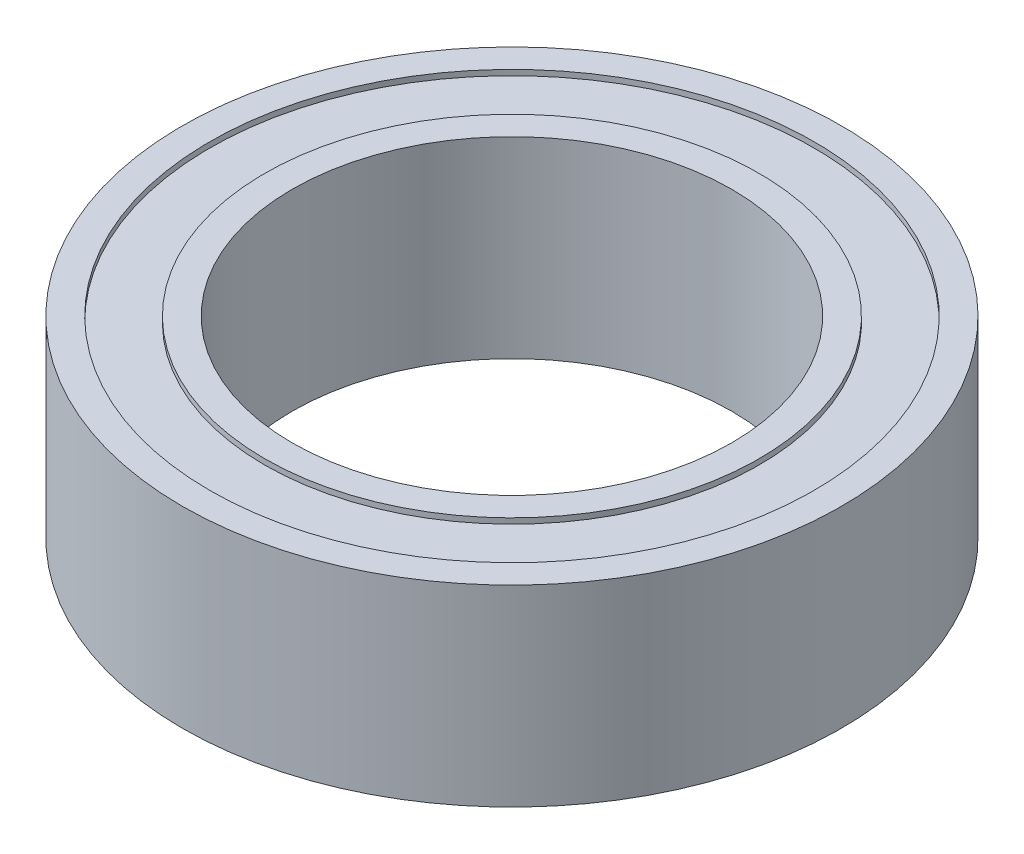
ISO-10303-21;
HEADER;
FILE_DESCRIPTION(('STEP AP214'),'2;1');
FILE_NAME('part.step','',(''),(''),'','','');
FILE_SCHEMA(('AUTOMOTIVE_DESIGN { 1 0 10303 214 1 1 1 1 }'));
ENDSEC;
DATA;
#1=APPLICATION_CONTEXT('core data for automotive mechanical design processes');
#2=APPLICATION_PROTOCOL_DEFINITION('international standard','automotive_design',2000,#1);
#3=PRODUCT_CONTEXT('',#1,'mechanical');
#4=PRODUCT('Part','Part','',(#3));
#5=PRODUCT_RELATED_PRODUCT_CATEGORY('part','',(#4));
#6=PRODUCT_DEFINITION_FORMATION('','',#4);
#7=PRODUCT_DEFINITION_CONTEXT('part definition',#1,'design');
#8=PRODUCT_DEFINITION('design','',#6,#7);
#9=PRODUCT_DEFINITION_SHAPE('','',#8);
#10=(LENGTH_UNIT() NAMED_UNIT(*) SI_UNIT(.MILLI.,.METRE.));
#11=(NAMED_UNIT(*) PLANE_ANGLE_UNIT() SI_UNIT($,.RADIAN.));
#12=(NAMED_UNIT(*) SI_UNIT($,.STERADIAN.) SOLID_ANGLE_UNIT());
#13=UNCERTAINTY_MEASURE_WITH_UNIT(LENGTH_MEASURE(1.E-05),#10,'distance_accuracy_value','');
#14=(GEOMETRIC_REPRESENTATION_CONTEXT(3) GLOBAL_UNCERTAINTY_ASSIGNED_CONTEXT((#13)) GLOBAL_UNIT_ASSIGNED_CONTEXT((#10,
#11,#12)) REPRESENTATION_CONTEXT('',''));
#15=CARTESIAN_POINT('',(0.,0.,0.));
#16=DIRECTION('',(0.,0.,1.));
#17=DIRECTION('',(1.,0.,0.));
#18=AXIS2_PLACEMENT_3D('',#15,#16,#17);
#19=CARTESIAN_POINT('',(0.,0.,0.));
#20=DIRECTION('',(0.,1.,0.));
#21=DIRECTION('',(0.,0.,1.));
#22=AXIS2_PLACEMENT_3D('',#19,#20,#21);
#23=PLANE('',#22);
#24=CARTESIAN_POINT('',(0.,0.,0.));
#25=DIRECTION('',(0.,1.,0.));
#26=DIRECTION('',(0.,0.,1.));
#27=AXIS2_PLACEMENT_3D('',#24,#25,#26);
#28=CIRCLE('',#27,4.);
#29=CARTESIAN_POINT('',(0.,0.,4.));
#30=VERTEX_POINT('',#29);
#31=EDGE_CURVE('E45',#30,#30,#28,.F.);
#32=ORIENTED_EDGE('',*,*,#31,.F.);
#33=EDGE_LOOP('',(#32));
#34=FACE_BOUND('',#33,.T.);
#35=CARTESIAN_POINT('',(0.,0.,0.));
#36=DIRECTION('',(0.,-1.,0.));
#37=DIRECTION('',(0.,0.,-1.));
#38=AXIS2_PLACEMENT_3D('',#35,#36,#37);
#39=CIRCLE('',#38,4.5);
#40=CARTESIAN_POINT('',(0.,0.,-4.5));
#41=VERTEX_POINT('',#40);
#42=EDGE_CURVE('E71',#41,#41,#39,.T.);
#43=ORIENTED_EDGE('',*,*,#42,.T.);
#44=EDGE_LOOP('',(#43));
#45=FACE_BOUND('',#44,.T.);
#46=ADVANCED_FACE('F34',(#34,#45),#23,.F.);
#47=CARTESIAN_POINT('',(0.,3.5,0.));
#48=DIRECTION('',(0.,1.,0.));
#49=DIRECTION('',(0.,0.,1.));
#50=AXIS2_PLACEMENT_3D('',#47,#48,#49);
#51=PLANE('',#50);
#52=CARTESIAN_POINT('',(0.,3.5,0.));
#53=DIRECTION('',(0.,1.,0.));
#54=DIRECTION('',(0.,0.,1.));
#55=AXIS2_PLACEMENT_3D('',#52,#53,#54);
#56=CIRCLE('',#55,4.);
#57=CARTESIAN_POINT('',(0.,3.5,4.));
#58=VERTEX_POINT('',#57);
#59=EDGE_CURVE('E49',#58,#58,#56,.T.);
#60=ORIENTED_EDGE('',*,*,#59,.F.);
#61=EDGE_LOOP('',(#60));
#62=FACE_BOUND('',#61,.T.);
#63=CARTESIAN_POINT('',(0.,3.5,0.));
#64=DIRECTION('',(0.,1.,0.));
#65=DIRECTION('',(0.,0.,1.));
#66=AXIS2_PLACEMENT_3D('',#63,#64,#65);
#67=CIRCLE('',#66,4.5);
#68=CARTESIAN_POINT('',(0.,3.5,4.5));
#69=VERTEX_POINT('',#68);
#70=EDGE_CURVE('E59',#69,#69,#67,.T.);
#71=ORIENTED_EDGE('',*,*,#70,.T.);
#72=EDGE_LOOP('',(#71));
#73=FACE_BOUND('',#72,.T.);
#74=ADVANCED_FACE('F101',(#62,#73),#51,.T.);
#75=CARTESIAN_POINT('',(0.,3.5,0.));
#76=DIRECTION('',(0.,-1.,0.));
#77=DIRECTION('',(0.,0.,-1.));
#78=AXIS2_PLACEMENT_3D('',#75,#76,#77);
#79=CYLINDRICAL_SURFACE('',#78,6.);
#80=CARTESIAN_POINT('',(0.,3.5,0.));
#81=DIRECTION('',(0.,1.,0.));
#82=DIRECTION('',(0.,0.,1.));
#83=AXIS2_PLACEMENT_3D('',#80,#81,#82);
#84=CIRCLE('',#83,6.);
#85=CARTESIAN_POINT('',(0.,3.5,6.));
#86=VERTEX_POINT('',#85);
#87=EDGE_CURVE('E10',#86,#86,#84,.T.);
#88=ORIENTED_EDGE('',*,*,#87,.F.);
#89=EDGE_LOOP('',(#88));
#90=FACE_BOUND('',#89,.T.);
#91=CARTESIAN_POINT('',(0.,0.,0.));
#92=DIRECTION('',(0.,1.,0.));
#93=DIRECTION('',(0.,0.,1.));
#94=AXIS2_PLACEMENT_3D('',#91,#92,#93);
#95=CIRCLE('',#94,6.);
#96=CARTESIAN_POINT('',(0.,0.,6.));
#97=VERTEX_POINT('',#96);
#98=EDGE_CURVE('E38',#97,#97,#95,.T.);
#99=ORIENTED_EDGE('',*,*,#98,.T.);
#100=EDGE_LOOP('',(#99));
#101=FACE_BOUND('',#100,.T.);
#102=ADVANCED_FACE('F36',(#90,#101),#79,.T.);
#103=CARTESIAN_POINT('',(0.,3.5,0.));
#104=DIRECTION('',(0.,1.,0.));
#105=DIRECTION('',(0.,0.,1.));
#106=AXIS2_PLACEMENT_3D('',#103,#104,#105);
#107=CIRCLE('',#106,5.5);
#108=CARTESIAN_POINT('',(0.,3.5,5.5));
#109=VERTEX_POINT('',#108);
#110=EDGE_CURVE('E53',#109,#109,#107,.T.);
#111=ORIENTED_EDGE('',*,*,#110,.F.);
#112=EDGE_LOOP('',(#111));
#113=FACE_BOUND('',#112,.T.);
#114=ORIENTED_EDGE('',*,*,#87,.T.);
#115=EDGE_LOOP('',(#114));
#116=FACE_BOUND('',#115,.T.);
#117=ADVANCED_FACE('F97',(#113,#116),#51,.T.);
#118=CARTESIAN_POINT('',(0.,0.,0.));
#119=DIRECTION('',(0.,-1.,0.));
#120=DIRECTION('',(0.,0.,-1.));
#121=AXIS2_PLACEMENT_3D('',#118,#119,#120);
#122=CIRCLE('',#121,5.5);
#123=CARTESIAN_POINT('',(0.,0.,-5.5));
#124=VERTEX_POINT('',#123);
#125=EDGE_CURVE('E65',#124,#124,#122,.T.);
#126=ORIENTED_EDGE('',*,*,#125,.F.);
#127=EDGE_LOOP('',(#126));
#128=FACE_BOUND('',#127,.T.);
#129=ORIENTED_EDGE('',*,*,#98,.F.);
#130=EDGE_LOOP('',(#129));
#131=FACE_BOUND('',#130,.T.);
#132=ADVANCED_FACE('F93',(#128,#131),#23,.F.);
#133=CARTESIAN_POINT('',(0.,-0.00100000000000013,0.));
#134=DIRECTION('',(0.,1.,0.));
#135=DIRECTION('',(0.,0.,1.));
#136=AXIS2_PLACEMENT_3D('',#133,#134,#135);
#137=CYLINDRICAL_SURFACE('',#136,4.);
#138=CARTESIAN_POINT('',(0.,3.5,4.));
#139=CARTESIAN_POINT('',(0.,3.46354166666667,4.));
#140=CARTESIAN_POINT('',(0.,3.42708333333333,4.));
#141=CARTESIAN_POINT('',(0.,3.35416666666667,4.));
#142=CARTESIAN_POINT('',(0.,3.31770833333333,4.));
#143=CARTESIAN_POINT('',(0.,3.24479166666667,4.));
#144=CARTESIAN_POINT('',(0.,3.20833333333333,4.));
#145=CARTESIAN_POINT('',(0.,3.13541666666667,4.));
#146=CARTESIAN_POINT('',(0.,3.09895833333333,4.));
#147=CARTESIAN_POINT('',(0.,3.02604166666667,4.));
#148=CARTESIAN_POINT('',(0.,2.98958333333333,4.));
#149=CARTESIAN_POINT('',(0.,2.91666666666667,4.));
#150=CARTESIAN_POINT('',(0.,2.88020833333333,4.));
#151=CARTESIAN_POINT('',(0.,2.80729166666667,4.));
#152=CARTESIAN_POINT('',(0.,2.77083333333333,4.));
#153=CARTESIAN_POINT('',(0.,2.69791666666667,4.));
#154=CARTESIAN_POINT('',(0.,2.66145833333333,4.));
#155=CARTESIAN_POINT('',(0.,2.58854166666667,4.));
#156=CARTESIAN_POINT('',(0.,2.55208333333333,4.));
#157=CARTESIAN_POINT('',(0.,2.47916666666667,4.));
#158=CARTESIAN_POINT('',(0.,2.44270833333333,4.));
#159=CARTESIAN_POINT('',(0.,2.36979166666667,4.));
#160=CARTESIAN_POINT('',(0.,2.33333333333333,4.));
#161=CARTESIAN_POINT('',(0.,2.26041666666667,4.));
#162=CARTESIAN_POINT('',(0.,2.22395833333333,4.));
#163=CARTESIAN_POINT('',(0.,2.15104166666667,4.));
#164=CARTESIAN_POINT('',(0.,2.11458333333333,4.));
#165=CARTESIAN_POINT('',(0.,2.04166666666667,4.));
#166=CARTESIAN_POINT('',(0.,2.00520833333333,4.));
#167=CARTESIAN_POINT('',(0.,1.93229166666667,4.));
#168=CARTESIAN_POINT('',(0.,1.89583333333333,4.));
#169=CARTESIAN_POINT('',(0.,1.82291666666667,4.));
#170=CARTESIAN_POINT('',(0.,1.78645833333333,4.));
#171=CARTESIAN_POINT('',(0.,1.71354166666667,4.));
#172=CARTESIAN_POINT('',(0.,1.67708333333333,4.));
#173=CARTESIAN_POINT('',(0.,1.60416666666667,4.));
#174=CARTESIAN_POINT('',(0.,1.56770833333333,4.));
#175=CARTESIAN_POINT('',(0.,1.49479166666667,4.));
#176=CARTESIAN_POINT('',(0.,1.45833333333333,4.));
#177=CARTESIAN_POINT('',(0.,1.38541666666667,4.));
#178=CARTESIAN_POINT('',(0.,1.34895833333333,4.));
#179=CARTESIAN_POINT('',(0.,1.27604166666667,4.));
#180=CARTESIAN_POINT('',(0.,1.23958333333333,4.));
#181=CARTESIAN_POINT('',(0.,1.16666666666667,4.));
#182=CARTESIAN_POINT('',(0.,1.13020833333333,4.));
#183=CARTESIAN_POINT('',(0.,1.05729166666667,4.));
#184=CARTESIAN_POINT('',(0.,1.02083333333333,4.));
#185=CARTESIAN_POINT('',(0.,0.947916666666666,4.));
#186=CARTESIAN_POINT('',(0.,0.911458333333333,4.));
#187=CARTESIAN_POINT('',(0.,0.838541666666667,4.));
#188=CARTESIAN_POINT('',(0.,0.802083333333333,4.));
#189=CARTESIAN_POINT('',(0.,0.729166666666667,4.));
#190=CARTESIAN_POINT('',(0.,0.692708333333333,4.));
#191=CARTESIAN_POINT('',(0.,0.619791666666667,4.));
#192=CARTESIAN_POINT('',(0.,0.583333333333333,4.));
#193=CARTESIAN_POINT('',(0.,0.510416666666667,4.));
#194=CARTESIAN_POINT('',(0.,0.473958333333333,4.));
#195=CARTESIAN_POINT('',(0.,0.401041666666667,4.));
#196=CARTESIAN_POINT('',(0.,0.364583333333333,4.));
#197=CARTESIAN_POINT('',(0.,0.291666666666667,4.));
#198=CARTESIAN_POINT('',(0.,0.255208333333333,4.));
#199=CARTESIAN_POINT('',(0.,0.182291666666667,4.));
#200=CARTESIAN_POINT('',(0.,0.145833333333333,4.));
#201=CARTESIAN_POINT('',(0.,0.0729166666666667,4.));
#202=CARTESIAN_POINT('',(0.,0.0364583333333333,4.));
#203=CARTESIAN_POINT('',(0.,0.,4.));
#204=B_SPLINE_CURVE_WITH_KNOTS('',3,(#138,#139,#140,#141,#142,#143,#144,#145,#146,#147,#148,
#149,#150,#151,#152,#153,#154,#155,#156,#157,#158,#159,#160,#161,#162,#163,#164,#165,#166,#167,
#168,#169,#170,#171,#172,#173,#174,#175,#176,#177,#178,#179,#180,#181,#182,#183,#184,#185,#186,
#187,#188,#189,#190,#191,#192,#193,#194,#195,#196,#197,#198,#199,#200,#201,#202,#203),
.UNSPECIFIED.,.F.,.F.,(4,2,2,2,2,2,2,2,2,2,2,2,2,2,2,2,2,2,2,2,2,2,2,2,2,2,2,2,2,2,2,2,4),(0.,
0.109375,0.21875,0.328125,0.4375,0.546875,0.65625,0.765625,0.875,0.984375,1.09375,1.203125,
1.3125,1.421875,1.53125,1.640625,1.75,1.859375,1.96875,2.078125,2.1875,2.296875,2.40625,
2.515625,2.625,2.734375,2.84375,2.953125,3.0625,3.171875,3.28125,3.390625,3.5),.UNSPECIFIED.);
#205=EDGE_CURVE('BSEAM96',#58,#30,#204,.T.);
#206=ORIENTED_EDGE('',*,*,#59,.T.);
#207=ORIENTED_EDGE('',*,*,#31,.T.);
#208=ORIENTED_EDGE('',*,*,#205,.T.);
#209=ORIENTED_EDGE('',*,*,#205,.F.);
#210=EDGE_LOOP('',(#206,#208,#207,#209));
#211=FACE_BOUND('',#210,.T.);
#212=ADVANCED_FACE('F96',(#211),#137,.F.);
#213=CARTESIAN_POINT('',(0.,3.4,0.));
#214=DIRECTION('',(0.,1.,0.));
#215=DIRECTION('',(0.,0.,1.));
#216=AXIS2_PLACEMENT_3D('',#213,#214,#215);
#217=CYLINDRICAL_SURFACE('',#216,5.5);
#218=CARTESIAN_POINT('',(0.,3.4,0.));
#219=DIRECTION('',(0.,1.,0.));
#220=DIRECTION('',(0.,0.,1.));
#221=AXIS2_PLACEMENT_3D('',#218,#219,#220);
#222=CIRCLE('',#221,5.5);
#223=CARTESIAN_POINT('',(0.,3.4,5.5));
#224=VERTEX_POINT('',#223);
#225=EDGE_CURVE('E52',#224,#224,#222,.T.);
#226=ORIENTED_EDGE('',*,*,#225,.F.);
#227=EDGE_LOOP('',(#226));
#228=FACE_BOUND('',#227,.T.);
#229=ORIENTED_EDGE('',*,*,#110,.T.);
#230=EDGE_LOOP('',(#229));
#231=FACE_BOUND('',#230,.T.);
#232=ADVANCED_FACE('F119',(#228,#231),#217,.F.);
#233=CARTESIAN_POINT('',(0.,3.4,0.));
#234=DIRECTION('',(0.,1.,0.));
#235=DIRECTION('',(0.,0.,1.));
#236=AXIS2_PLACEMENT_3D('',#233,#234,#235);
#237=PLANE('',#236);
#238=CARTESIAN_POINT('',(0.,3.4,0.));
#239=DIRECTION('',(0.,1.,0.));
#240=DIRECTION('',(0.,0.,1.));
#241=AXIS2_PLACEMENT_3D('',#238,#239,#240);
#242=CIRCLE('',#241,4.5);
#243=CARTESIAN_POINT('',(0.,3.4,4.5));
#244=VERTEX_POINT('',#243);
#245=EDGE_CURVE('E56',#244,#244,#242,.T.);
#246=ORIENTED_EDGE('',*,*,#245,.F.);
#247=EDGE_LOOP('',(#246));
#248=FACE_BOUND('',#247,.T.);
#249=ORIENTED_EDGE('',*,*,#225,.T.);
#250=EDGE_LOOP('',(#249));
#251=FACE_BOUND('',#250,.T.);
#252=ADVANCED_FACE('F123',(#248,#251),#237,.T.);
#253=CARTESIAN_POINT('',(0.,3.4,0.));
#254=DIRECTION('',(0.,1.,0.));
#255=DIRECTION('',(0.,0.,1.));
#256=AXIS2_PLACEMENT_3D('',#253,#254,#255);
#257=CYLINDRICAL_SURFACE('',#256,4.5);
#258=ORIENTED_EDGE('',*,*,#245,.T.);
#259=EDGE_LOOP('',(#258));
#260=FACE_BOUND('',#259,.T.);
#261=ORIENTED_EDGE('',*,*,#70,.F.);
#262=EDGE_LOOP('',(#261));
#263=FACE_BOUND('',#262,.T.);
#264=ADVANCED_FACE('F89',(#260,#263),#257,.T.);
#265=CARTESIAN_POINT('',(0.,0.1,0.));
#266=DIRECTION('',(0.,-1.,0.));
#267=DIRECTION('',(0.,0.,-1.));
#268=AXIS2_PLACEMENT_3D('',#265,#266,#267);
#269=CYLINDRICAL_SURFACE('',#268,5.5);
#270=CARTESIAN_POINT('',(0.,0.1,0.));
#271=DIRECTION('',(0.,-1.,0.));
#272=DIRECTION('',(0.,0.,-1.));
#273=AXIS2_PLACEMENT_3D('',#270,#271,#272);
#274=CIRCLE('',#273,5.5);
#275=CARTESIAN_POINT('',(0.,0.1,-5.5));
#276=VERTEX_POINT('',#275);
#277=EDGE_CURVE('E62',#276,#276,#274,.T.);
#278=ORIENTED_EDGE('',*,*,#277,.F.);
#279=EDGE_LOOP('',(#278));
#280=FACE_BOUND('',#279,.T.);
#281=ORIENTED_EDGE('',*,*,#125,.T.);
#282=EDGE_LOOP('',(#281));
#283=FACE_BOUND('',#282,.T.);
#284=ADVANCED_FACE('F83',(#280,#283),#269,.F.);
#285=CARTESIAN_POINT('',(0.,0.1,0.));
#286=DIRECTION('',(0.,-1.,0.));
#287=DIRECTION('',(0.,0.,-1.));
#288=AXIS2_PLACEMENT_3D('',#285,#286,#287);
#289=PLANE('',#288);
#290=CARTESIAN_POINT('',(0.,0.1,0.));
#291=DIRECTION('',(0.,-1.,0.));
#292=DIRECTION('',(0.,0.,-1.));
#293=AXIS2_PLACEMENT_3D('',#290,#291,#292);
#294=CIRCLE('',#293,4.5);
#295=CARTESIAN_POINT('',(0.,0.1,-4.5));
#296=VERTEX_POINT('',#295);
#297=EDGE_CURVE('E68',#296,#296,#294,.T.);
#298=ORIENTED_EDGE('',*,*,#297,.F.);
#299=EDGE_LOOP('',(#298));
#300=FACE_BOUND('',#299,.T.);
#301=ORIENTED_EDGE('',*,*,#277,.T.);
#302=EDGE_LOOP('',(#301));
#303=FACE_BOUND('',#302,.T.);
#304=ADVANCED_FACE('F80',(#300,#303),#289,.T.);
#305=CARTESIAN_POINT('',(0.,0.1,0.));
#306=DIRECTION('',(0.,-1.,0.));
#307=DIRECTION('',(0.,0.,-1.));
#308=AXIS2_PLACEMENT_3D('',#305,#306,#307);
#309=CYLINDRICAL_SURFACE('',#308,4.5);
#310=ORIENTED_EDGE('',*,*,#297,.T.);
#311=EDGE_LOOP('',(#310));
#312=FACE_BOUND('',#311,.T.);
#313=ORIENTED_EDGE('',*,*,#42,.F.);
#314=EDGE_LOOP('',(#313));
#315=FACE_BOUND('',#314,.T.);
#316=ADVANCED_FACE('F77',(#312,#315),#309,.T.);
#317=CLOSED_SHELL('',(#46,#74,#102,#117,#132,#212,#232,#252,#264,#284,#304,#316));
#318=MANIFOLD_SOLID_BREP('B2',#317);
#319=ADVANCED_BREP_SHAPE_REPRESENTATION('',(#18,#318),#14);
#320=SHAPE_DEFINITION_REPRESENTATION(#9,#319);
ENDSEC;
END-ISO-10303-21;
